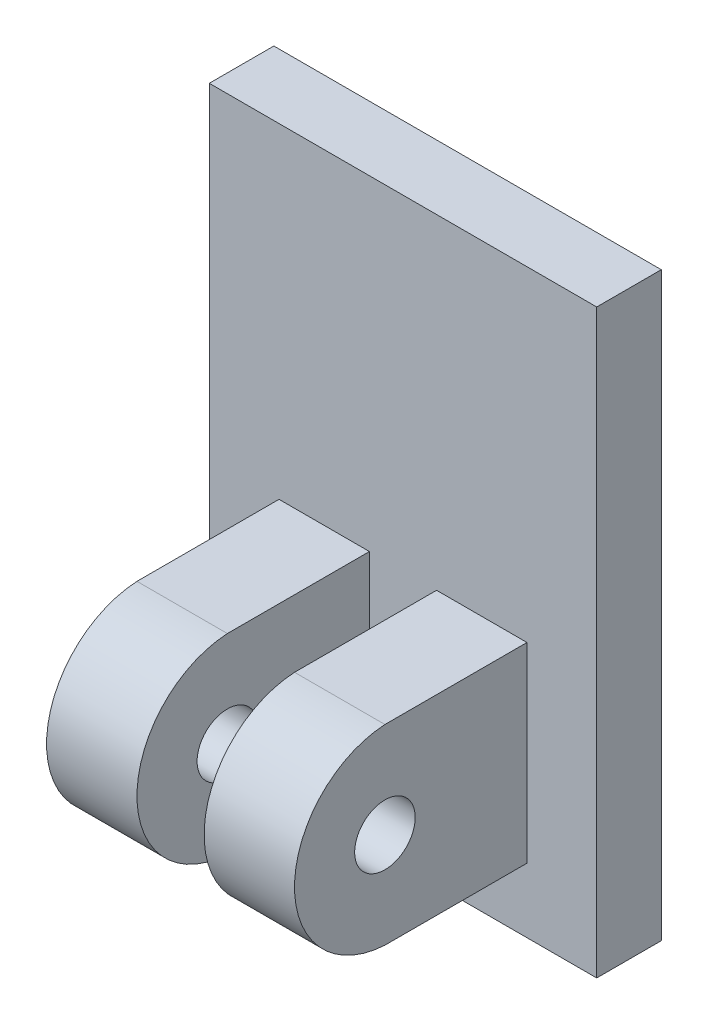
ISO-10303-21;
HEADER;
FILE_DESCRIPTION(('STEP AP214'),'2;1');
FILE_NAME('part.step','',(''),(''),'','','');
FILE_SCHEMA(('AUTOMOTIVE_DESIGN { 1 0 10303 214 1 1 1 1 }'));
ENDSEC;
DATA;
#1=APPLICATION_CONTEXT('core data for automotive mechanical design processes');
#2=APPLICATION_PROTOCOL_DEFINITION('international standard','automotive_design',2000,#1);
#3=PRODUCT_CONTEXT('',#1,'mechanical');
#4=PRODUCT('Part','Part','',(#3));
#5=PRODUCT_RELATED_PRODUCT_CATEGORY('part','',(#4));
#6=PRODUCT_DEFINITION_FORMATION('','',#4);
#7=PRODUCT_DEFINITION_CONTEXT('part definition',#1,'design');
#8=PRODUCT_DEFINITION('design','',#6,#7);
#9=PRODUCT_DEFINITION_SHAPE('','',#8);
#10=(LENGTH_UNIT() NAMED_UNIT(*) SI_UNIT(.MILLI.,.METRE.));
#11=(NAMED_UNIT(*) PLANE_ANGLE_UNIT() SI_UNIT($,.RADIAN.));
#12=(NAMED_UNIT(*) SI_UNIT($,.STERADIAN.) SOLID_ANGLE_UNIT());
#13=UNCERTAINTY_MEASURE_WITH_UNIT(LENGTH_MEASURE(1.E-05),#10,'distance_accuracy_value','');
#14=(GEOMETRIC_REPRESENTATION_CONTEXT(3) GLOBAL_UNCERTAINTY_ASSIGNED_CONTEXT((#13)) GLOBAL_UNIT_ASSIGNED_CONTEXT((#10,
#11,#12)) REPRESENTATION_CONTEXT('',''));
#15=CARTESIAN_POINT('',(0.,0.,0.));
#16=DIRECTION('',(0.,0.,1.));
#17=DIRECTION('',(1.,0.,0.));
#18=AXIS2_PLACEMENT_3D('',#15,#16,#17);
#19=CARTESIAN_POINT('',(12.4,19.8,23.));
#20=DIRECTION('',(1.,0.,0.));
#21=DIRECTION('',(0.,0.,-1.));
#22=AXIS2_PLACEMENT_3D('',#19,#20,#21);
#23=PLANE('',#22);
#24=CARTESIAN_POINT('',(12.4,12.4,16.));
#25=DIRECTION('',(1.,0.,0.));
#26=DIRECTION('',(0.,0.,-1.));
#27=AXIS2_PLACEMENT_3D('',#24,#25,#26);
#28=CIRCLE('',#27,2.34375);
#29=CARTESIAN_POINT('',(12.4,12.4,13.65625));
#30=VERTEX_POINT('',#29);
#31=EDGE_CURVE('E201',#30,#30,#28,.T.);
#32=ORIENTED_EDGE('',*,*,#31,.F.);
#33=EDGE_LOOP('',(#32));
#34=FACE_BOUND('',#33,.T.);
#35=CARTESIAN_POINT('',(12.4,12.4,15.5885714285714));
#36=DIRECTION('',(1.,0.,0.));
#37=DIRECTION('',(0.,0.,-1.));
#38=AXIS2_PLACEMENT_3D('',#35,#36,#37);
#39=CIRCLE('',#38,7.41142857142857);
#40=CARTESIAN_POINT('',(12.4,19.8,16.));
#41=VERTEX_POINT('',#40);
#42=CARTESIAN_POINT('',(12.4,5.,16.));
#43=VERTEX_POINT('',#42);
#44=EDGE_CURVE('E473',#41,#43,#39,.T.);
#45=ORIENTED_EDGE('',*,*,#44,.T.);
#46=DIRECTION('',(0.,0.,-1.));
#47=VECTOR('',#46,1.);
#48=CARTESIAN_POINT('',(12.4,5.,23.));
#49=LINE('',#48,#47);
#50=CARTESIAN_POINT('',(12.4,5.,5.));
#51=VERTEX_POINT('',#50);
#52=EDGE_CURVE('E236',#43,#51,#49,.T.);
#53=ORIENTED_EDGE('',*,*,#52,.T.);
#54=DIRECTION('',(0.,-1.,0.));
#55=VECTOR('',#54,1.);
#56=CARTESIAN_POINT('',(12.4,19.8,5.));
#57=LINE('',#56,#55);
#58=CARTESIAN_POINT('',(12.4,19.8,5.));
#59=VERTEX_POINT('',#58);
#60=EDGE_CURVE('E223',#59,#51,#57,.T.);
#61=ORIENTED_EDGE('',*,*,#60,.F.);
#62=DIRECTION('',(0.,0.,-1.));
#63=VECTOR('',#62,1.);
#64=CARTESIAN_POINT('',(12.4,19.8,23.));
#65=LINE('',#64,#63);
#66=EDGE_CURVE('E234',#41,#59,#65,.T.);
#67=ORIENTED_EDGE('',*,*,#66,.F.);
#68=EDGE_LOOP('',(#45,#53,#61,#67));
#69=FACE_BOUND('',#68,.T.);
#70=ADVANCED_FACE('F83',(#34,#69),#23,.T.);
#71=CARTESIAN_POINT('',(5.4,19.8,23.));
#72=DIRECTION('',(1.,0.,0.));
#73=DIRECTION('',(0.,0.,-1.));
#74=AXIS2_PLACEMENT_3D('',#71,#72,#73);
#75=PLANE('',#74);
#76=CARTESIAN_POINT('',(5.4,12.4,16.));
#77=DIRECTION('',(1.,0.,0.));
#78=DIRECTION('',(0.,0.,-1.));
#79=AXIS2_PLACEMENT_3D('',#76,#77,#78);
#80=CIRCLE('',#79,2.34375);
#81=CARTESIAN_POINT('',(5.4,12.4,13.65625));
#82=VERTEX_POINT('',#81);
#83=EDGE_CURVE('E205',#82,#82,#80,.T.);
#84=ORIENTED_EDGE('',*,*,#83,.T.);
#85=EDGE_LOOP('',(#84));
#86=FACE_BOUND('',#85,.T.);
#87=DIRECTION('',(0.,0.,-1.));
#88=VECTOR('',#87,1.);
#89=CARTESIAN_POINT('',(5.4,5.,23.));
#90=LINE('',#89,#88);
#91=CARTESIAN_POINT('',(5.4,5.,16.));
#92=VERTEX_POINT('',#91);
#93=CARTESIAN_POINT('',(5.4,5.,5.));
#94=VERTEX_POINT('',#93);
#95=EDGE_CURVE('E231',#92,#94,#90,.T.);
#96=ORIENTED_EDGE('',*,*,#95,.F.);
#97=CARTESIAN_POINT('',(5.4,12.4,15.5885714285714));
#98=DIRECTION('',(1.,0.,0.));
#99=DIRECTION('',(0.,0.,-1.));
#100=AXIS2_PLACEMENT_3D('',#97,#98,#99);
#101=CIRCLE('',#100,7.41142857142857);
#102=CARTESIAN_POINT('',(5.4,19.8,16.));
#103=VERTEX_POINT('',#102);
#104=EDGE_CURVE('E186',#103,#92,#101,.T.);
#105=ORIENTED_EDGE('',*,*,#104,.F.);
#106=DIRECTION('',(0.,0.,-1.));
#107=VECTOR('',#106,1.);
#108=CARTESIAN_POINT('',(5.4,19.8,23.));
#109=LINE('',#108,#107);
#110=CARTESIAN_POINT('',(5.4,19.8,5.));
#111=VERTEX_POINT('',#110);
#112=EDGE_CURVE('E107',#103,#111,#109,.T.);
#113=ORIENTED_EDGE('',*,*,#112,.T.);
#114=DIRECTION('',(0.,-1.,0.));
#115=VECTOR('',#114,1.);
#116=CARTESIAN_POINT('',(5.4,19.8,5.));
#117=LINE('',#116,#115);
#118=EDGE_CURVE('E229',#111,#94,#117,.T.);
#119=ORIENTED_EDGE('',*,*,#118,.T.);
#120=EDGE_LOOP('',(#96,#105,#113,#119));
#121=FACE_BOUND('',#120,.T.);
#122=ADVANCED_FACE('F293',(#86,#121),#75,.F.);
#123=CARTESIAN_POINT('',(24.6,19.8,23.));
#124=DIRECTION('',(1.,0.,0.));
#125=DIRECTION('',(0.,1.,0.));
#126=AXIS2_PLACEMENT_3D('',#123,#124,#125);
#127=PLANE('',#126);
#128=CARTESIAN_POINT('',(24.6,12.4,16.));
#129=DIRECTION('',(1.,0.,0.));
#130=DIRECTION('',(0.,1.,0.));
#131=AXIS2_PLACEMENT_3D('',#128,#129,#130);
#132=CIRCLE('',#131,2.34375);
#133=CARTESIAN_POINT('',(24.6,14.74375,16.));
#134=VERTEX_POINT('',#133);
#135=EDGE_CURVE('E475',#134,#134,#132,.T.);
#136=ORIENTED_EDGE('',*,*,#135,.F.);
#137=EDGE_LOOP('',(#136));
#138=FACE_BOUND('',#137,.T.);
#139=CARTESIAN_POINT('',(24.6,12.4,15.5885714285714));
#140=DIRECTION('',(1.,0.,0.));
#141=DIRECTION('',(0.,1.,0.));
#142=AXIS2_PLACEMENT_3D('',#139,#140,#141);
#143=CIRCLE('',#142,7.41142857142857);
#144=CARTESIAN_POINT('',(24.6,19.8,16.));
#145=VERTEX_POINT('',#144);
#146=CARTESIAN_POINT('',(24.6,5.,16.));
#147=VERTEX_POINT('',#146);
#148=EDGE_CURVE('E176',#145,#147,#143,.T.);
#149=ORIENTED_EDGE('',*,*,#148,.T.);
#150=DIRECTION('',(0.,0.,-1.));
#151=VECTOR('',#150,1.);
#152=CARTESIAN_POINT('',(24.6,5.,23.));
#153=LINE('',#152,#151);
#154=CARTESIAN_POINT('',(24.6,5.,5.));
#155=VERTEX_POINT('',#154);
#156=EDGE_CURVE('E181',#147,#155,#153,.T.);
#157=ORIENTED_EDGE('',*,*,#156,.T.);
#158=DIRECTION('',(0.,-1.,0.));
#159=VECTOR('',#158,1.);
#160=CARTESIAN_POINT('',(24.6,19.8,5.));
#161=LINE('',#160,#159);
#162=CARTESIAN_POINT('',(24.6,19.8,5.));
#163=VERTEX_POINT('',#162);
#164=EDGE_CURVE('E217',#163,#155,#161,.T.);
#165=ORIENTED_EDGE('',*,*,#164,.F.);
#166=DIRECTION('',(0.,0.,-1.));
#167=VECTOR('',#166,1.);
#168=CARTESIAN_POINT('',(24.6,19.8,23.));
#169=LINE('',#168,#167);
#170=EDGE_CURVE('E183',#145,#163,#169,.T.);
#171=ORIENTED_EDGE('',*,*,#170,.F.);
#172=EDGE_LOOP('',(#149,#157,#165,#171));
#173=FACE_BOUND('',#172,.T.);
#174=ADVANCED_FACE('F178',(#138,#173),#127,.T.);
#175=CARTESIAN_POINT('',(17.6,19.8,23.));
#176=DIRECTION('',(1.,0.,0.));
#177=DIRECTION('',(0.,1.,0.));
#178=AXIS2_PLACEMENT_3D('',#175,#176,#177);
#179=PLANE('',#178);
#180=CARTESIAN_POINT('',(17.6,12.4,16.));
#181=DIRECTION('',(1.,0.,0.));
#182=DIRECTION('',(0.,1.,0.));
#183=AXIS2_PLACEMENT_3D('',#180,#181,#182);
#184=CIRCLE('',#183,2.34375);
#185=CARTESIAN_POINT('',(17.6,14.74375,16.));
#186=VERTEX_POINT('',#185);
#187=EDGE_CURVE('E87',#186,#186,#184,.T.);
#188=ORIENTED_EDGE('',*,*,#187,.T.);
#189=EDGE_LOOP('',(#188));
#190=FACE_BOUND('',#189,.T.);
#191=DIRECTION('',(0.,0.,-1.));
#192=VECTOR('',#191,1.);
#193=CARTESIAN_POINT('',(17.6,5.,23.));
#194=LINE('',#193,#192);
#195=CARTESIAN_POINT('',(17.6,5.,16.));
#196=VERTEX_POINT('',#195);
#197=CARTESIAN_POINT('',(17.6,5.,5.));
#198=VERTEX_POINT('',#197);
#199=EDGE_CURVE('E210',#196,#198,#194,.T.);
#200=ORIENTED_EDGE('',*,*,#199,.F.);
#201=CARTESIAN_POINT('',(17.6,12.4,15.5885714285714));
#202=DIRECTION('',(1.,0.,0.));
#203=DIRECTION('',(0.,1.,0.));
#204=AXIS2_PLACEMENT_3D('',#201,#202,#203);
#205=CIRCLE('',#204,7.41142857142857);
#206=CARTESIAN_POINT('',(17.6,19.8,16.));
#207=VERTEX_POINT('',#206);
#208=EDGE_CURVE('E187',#207,#196,#205,.T.);
#209=ORIENTED_EDGE('',*,*,#208,.F.);
#210=DIRECTION('',(0.,0.,-1.));
#211=VECTOR('',#210,1.);
#212=CARTESIAN_POINT('',(17.6,19.8,23.));
#213=LINE('',#212,#211);
#214=CARTESIAN_POINT('',(17.6,19.8,5.));
#215=VERTEX_POINT('',#214);
#216=EDGE_CURVE('E99',#207,#215,#213,.T.);
#217=ORIENTED_EDGE('',*,*,#216,.T.);
#218=DIRECTION('',(0.,-1.,0.));
#219=VECTOR('',#218,1.);
#220=CARTESIAN_POINT('',(17.6,19.8,5.));
#221=LINE('',#220,#219);
#222=EDGE_CURVE('E212',#215,#198,#221,.T.);
#223=ORIENTED_EDGE('',*,*,#222,.T.);
#224=EDGE_LOOP('',(#200,#209,#217,#223));
#225=FACE_BOUND('',#224,.T.);
#226=ADVANCED_FACE('F398',(#190,#225),#179,.F.);
#227=CARTESIAN_POINT('',(5.4,19.8,23.));
#228=DIRECTION('',(0.,1.,0.));
#229=DIRECTION('',(-1.,0.,0.));
#230=AXIS2_PLACEMENT_3D('',#227,#228,#229);
#231=PLANE('',#230);
#232=ORIENTED_EDGE('',*,*,#112,.F.);
#233=DIRECTION('',(-1.,0.,0.));
#234=VECTOR('',#233,1.);
#235=CARTESIAN_POINT('',(30.,19.8,16.));
#236=LINE('',#235,#234);
#237=EDGE_CURVE('E194',#41,#103,#236,.T.);
#238=ORIENTED_EDGE('',*,*,#237,.F.);
#239=ORIENTED_EDGE('',*,*,#66,.T.);
#240=DIRECTION('',(1.,0.,0.));
#241=VECTOR('',#240,1.);
#242=CARTESIAN_POINT('',(5.4,19.8,5.));
#243=LINE('',#242,#241);
#244=EDGE_CURVE('E226',#111,#59,#243,.T.);
#245=ORIENTED_EDGE('',*,*,#244,.F.);
#246=EDGE_LOOP('',(#232,#238,#239,#245));
#247=FACE_BOUND('',#246,.T.);
#248=ADVANCED_FACE('F305',(#247),#231,.T.);
#249=CARTESIAN_POINT('',(17.6,19.8,23.));
#250=DIRECTION('',(0.,1.,0.));
#251=DIRECTION('',(0.,0.,1.));
#252=AXIS2_PLACEMENT_3D('',#249,#250,#251);
#253=PLANE('',#252);
#254=ORIENTED_EDGE('',*,*,#216,.F.);
#255=EDGE_CURVE('E466',#145,#207,#236,.T.);
#256=ORIENTED_EDGE('',*,*,#255,.F.);
#257=ORIENTED_EDGE('',*,*,#170,.T.);
#258=DIRECTION('',(1.,0.,0.));
#259=VECTOR('',#258,1.);
#260=CARTESIAN_POINT('',(17.6,19.8,5.));
#261=LINE('',#260,#259);
#262=EDGE_CURVE('E214',#215,#163,#261,.T.);
#263=ORIENTED_EDGE('',*,*,#262,.F.);
#264=EDGE_LOOP('',(#254,#256,#257,#263));
#265=FACE_BOUND('',#264,.T.);
#266=ADVANCED_FACE('F290',(#265),#253,.T.);
#267=CARTESIAN_POINT('',(0.,0.,5.));
#268=DIRECTION('',(0.,0.,1.));
#269=DIRECTION('',(1.,0.,0.));
#270=AXIS2_PLACEMENT_3D('',#267,#268,#269);
#271=PLANE('',#270);
#272=DIRECTION('',(1.,0.,0.));
#273=VECTOR('',#272,1.);
#274=CARTESIAN_POINT('',(0.,0.,5.));
#275=LINE('',#274,#273);
#276=CARTESIAN_POINT('',(0.,0.,5.));
#277=VERTEX_POINT('',#276);
#278=CARTESIAN_POINT('',(30.,0.,5.));
#279=VERTEX_POINT('',#278);
#280=EDGE_CURVE('E239',#277,#279,#275,.T.);
#281=ORIENTED_EDGE('',*,*,#280,.T.);
#282=DIRECTION('',(0.,1.,0.));
#283=VECTOR('',#282,1.);
#284=CARTESIAN_POINT('',(30.,0.,5.));
#285=LINE('',#284,#283);
#286=CARTESIAN_POINT('',(30.,45.,5.));
#287=VERTEX_POINT('',#286);
#288=EDGE_CURVE('E242',#279,#287,#285,.T.);
#289=ORIENTED_EDGE('',*,*,#288,.T.);
#290=DIRECTION('',(1.,0.,0.));
#291=VECTOR('',#290,1.);
#292=CARTESIAN_POINT('',(0.,45.,5.));
#293=LINE('',#292,#291);
#294=CARTESIAN_POINT('',(0.,45.,5.));
#295=VERTEX_POINT('',#294);
#296=EDGE_CURVE('E245',#295,#287,#293,.T.);
#297=ORIENTED_EDGE('',*,*,#296,.F.);
#298=DIRECTION('',(0.,1.,0.));
#299=VECTOR('',#298,1.);
#300=CARTESIAN_POINT('',(0.,0.,5.));
#301=LINE('',#300,#299);
#302=EDGE_CURVE('E248',#277,#295,#301,.T.);
#303=ORIENTED_EDGE('',*,*,#302,.F.);
#304=EDGE_LOOP('',(#281,#289,#297,#303));
#305=FACE_BOUND('',#304,.T.);
#306=ORIENTED_EDGE('',*,*,#60,.T.);
#307=DIRECTION('',(1.,0.,0.));
#308=VECTOR('',#307,1.);
#309=CARTESIAN_POINT('',(5.4,5.,5.));
#310=LINE('',#309,#308);
#311=EDGE_CURVE('E220',#94,#51,#310,.T.);
#312=ORIENTED_EDGE('',*,*,#311,.F.);
#313=ORIENTED_EDGE('',*,*,#118,.F.);
#314=ORIENTED_EDGE('',*,*,#244,.T.);
#315=EDGE_LOOP('',(#306,#312,#313,#314));
#316=FACE_BOUND('',#315,.T.);
#317=ORIENTED_EDGE('',*,*,#164,.T.);
#318=DIRECTION('',(1.,0.,0.));
#319=VECTOR('',#318,1.);
#320=CARTESIAN_POINT('',(17.6,5.,5.));
#321=LINE('',#320,#319);
#322=EDGE_CURVE('E199',#198,#155,#321,.T.);
#323=ORIENTED_EDGE('',*,*,#322,.F.);
#324=ORIENTED_EDGE('',*,*,#222,.F.);
#325=ORIENTED_EDGE('',*,*,#262,.T.);
#326=EDGE_LOOP('',(#317,#323,#324,#325));
#327=FACE_BOUND('',#326,.T.);
#328=ADVANCED_FACE('F282',(#305,#316,#327),#271,.T.);
#329=CARTESIAN_POINT('',(0.,0.,5.));
#330=DIRECTION('',(0.,1.,0.));
#331=DIRECTION('',(0.,0.,1.));
#332=AXIS2_PLACEMENT_3D('',#329,#330,#331);
#333=PLANE('',#332);
#334=DIRECTION('',(1.,0.,0.));
#335=VECTOR('',#334,1.);
#336=CARTESIAN_POINT('',(0.,0.,0.));
#337=LINE('',#336,#335);
#338=CARTESIAN_POINT('',(0.,0.,0.));
#339=VERTEX_POINT('',#338);
#340=CARTESIAN_POINT('',(30.,0.,0.));
#341=VERTEX_POINT('',#340);
#342=EDGE_CURVE('E238',#339,#341,#337,.T.);
#343=ORIENTED_EDGE('',*,*,#342,.T.);
#344=DIRECTION('',(0.,0.,-1.));
#345=VECTOR('',#344,1.);
#346=CARTESIAN_POINT('',(30.,0.,5.));
#347=LINE('',#346,#345);
#348=EDGE_CURVE('E12',#279,#341,#347,.T.);
#349=ORIENTED_EDGE('',*,*,#348,.F.);
#350=ORIENTED_EDGE('',*,*,#280,.F.);
#351=DIRECTION('',(0.,0.,-1.));
#352=VECTOR('',#351,1.);
#353=CARTESIAN_POINT('',(0.,0.,5.));
#354=LINE('',#353,#352);
#355=EDGE_CURVE('E251',#277,#339,#354,.T.);
#356=ORIENTED_EDGE('',*,*,#355,.T.);
#357=EDGE_LOOP('',(#343,#349,#350,#356));
#358=FACE_BOUND('',#357,.T.);
#359=ADVANCED_FACE('F85',(#358),#333,.F.);
#360=CARTESIAN_POINT('',(30.,0.,5.));
#361=DIRECTION('',(-1.,0.,0.));
#362=DIRECTION('',(0.,0.,1.));
#363=AXIS2_PLACEMENT_3D('',#360,#361,#362);
#364=PLANE('',#363);
#365=DIRECTION('',(0.,1.,0.));
#366=VECTOR('',#365,1.);
#367=CARTESIAN_POINT('',(30.,0.,0.));
#368=LINE('',#367,#366);
#369=CARTESIAN_POINT('',(30.,45.,0.));
#370=VERTEX_POINT('',#369);
#371=EDGE_CURVE('E254',#341,#370,#368,.T.);
#372=ORIENTED_EDGE('',*,*,#371,.T.);
#373=DIRECTION('',(0.,0.,-1.));
#374=VECTOR('',#373,1.);
#375=CARTESIAN_POINT('',(30.,45.,5.));
#376=LINE('',#375,#374);
#377=EDGE_CURVE('E92',#287,#370,#376,.T.);
#378=ORIENTED_EDGE('',*,*,#377,.F.);
#379=ORIENTED_EDGE('',*,*,#288,.F.);
#380=ORIENTED_EDGE('',*,*,#348,.T.);
#381=EDGE_LOOP('',(#372,#378,#379,#380));
#382=FACE_BOUND('',#381,.T.);
#383=ADVANCED_FACE('F271',(#382),#364,.F.);
#384=CARTESIAN_POINT('',(0.,45.,5.));
#385=DIRECTION('',(0.,1.,0.));
#386=DIRECTION('',(0.,0.,1.));
#387=AXIS2_PLACEMENT_3D('',#384,#385,#386);
#388=PLANE('',#387);
#389=DIRECTION('',(1.,0.,0.));
#390=VECTOR('',#389,1.);
#391=CARTESIAN_POINT('',(0.,45.,0.));
#392=LINE('',#391,#390);
#393=CARTESIAN_POINT('',(0.,45.,0.));
#394=VERTEX_POINT('',#393);
#395=EDGE_CURVE('E257',#394,#370,#392,.T.);
#396=ORIENTED_EDGE('',*,*,#395,.F.);
#397=DIRECTION('',(0.,0.,-1.));
#398=VECTOR('',#397,1.);
#399=CARTESIAN_POINT('',(0.,45.,5.));
#400=LINE('',#399,#398);
#401=EDGE_CURVE('E263',#295,#394,#400,.T.);
#402=ORIENTED_EDGE('',*,*,#401,.F.);
#403=ORIENTED_EDGE('',*,*,#296,.T.);
#404=ORIENTED_EDGE('',*,*,#377,.T.);
#405=EDGE_LOOP('',(#396,#402,#403,#404));
#406=FACE_BOUND('',#405,.T.);
#407=ADVANCED_FACE('F268',(#406),#388,.T.);
#408=CARTESIAN_POINT('',(0.,0.,5.));
#409=DIRECTION('',(-1.,0.,0.));
#410=DIRECTION('',(0.,0.,1.));
#411=AXIS2_PLACEMENT_3D('',#408,#409,#410);
#412=PLANE('',#411);
#413=DIRECTION('',(0.,1.,0.));
#414=VECTOR('',#413,1.);
#415=CARTESIAN_POINT('',(0.,0.,0.));
#416=LINE('',#415,#414);
#417=EDGE_CURVE('E243',#339,#394,#416,.T.);
#418=ORIENTED_EDGE('',*,*,#417,.F.);
#419=ORIENTED_EDGE('',*,*,#355,.F.);
#420=ORIENTED_EDGE('',*,*,#302,.T.);
#421=ORIENTED_EDGE('',*,*,#401,.T.);
#422=EDGE_LOOP('',(#418,#419,#420,#421));
#423=FACE_BOUND('',#422,.T.);
#424=ADVANCED_FACE('F278',(#423),#412,.T.);
#425=CARTESIAN_POINT('',(0.,0.,0.));
#426=DIRECTION('',(0.,0.,1.));
#427=DIRECTION('',(1.,0.,0.));
#428=AXIS2_PLACEMENT_3D('',#425,#426,#427);
#429=PLANE('',#428);
#430=ORIENTED_EDGE('',*,*,#342,.F.);
#431=ORIENTED_EDGE('',*,*,#417,.T.);
#432=ORIENTED_EDGE('',*,*,#395,.T.);
#433=ORIENTED_EDGE('',*,*,#371,.F.);
#434=EDGE_LOOP('',(#430,#431,#432,#433));
#435=FACE_BOUND('',#434,.T.);
#436=ADVANCED_FACE('F275',(#435),#429,.F.);
#437=CARTESIAN_POINT('',(5.4,5.,23.));
#438=DIRECTION('',(0.,1.,0.));
#439=DIRECTION('',(-1.,0.,0.));
#440=AXIS2_PLACEMENT_3D('',#437,#438,#439);
#441=PLANE('',#440);
#442=ORIENTED_EDGE('',*,*,#52,.F.);
#443=DIRECTION('',(-1.,0.,0.));
#444=VECTOR('',#443,1.);
#445=CARTESIAN_POINT('',(30.,5.,16.));
#446=LINE('',#445,#444);
#447=EDGE_CURVE('E195',#43,#92,#446,.T.);
#448=ORIENTED_EDGE('',*,*,#447,.T.);
#449=ORIENTED_EDGE('',*,*,#95,.T.);
#450=ORIENTED_EDGE('',*,*,#311,.T.);
#451=EDGE_LOOP('',(#442,#448,#449,#450));
#452=FACE_BOUND('',#451,.T.);
#453=ADVANCED_FACE('F306',(#452),#441,.F.);
#454=CARTESIAN_POINT('',(17.6,5.,23.));
#455=DIRECTION('',(0.,1.,0.));
#456=DIRECTION('',(-1.,0.,0.));
#457=AXIS2_PLACEMENT_3D('',#454,#455,#456);
#458=PLANE('',#457);
#459=ORIENTED_EDGE('',*,*,#156,.F.);
#460=EDGE_CURVE('E190',#147,#196,#446,.T.);
#461=ORIENTED_EDGE('',*,*,#460,.T.);
#462=ORIENTED_EDGE('',*,*,#199,.T.);
#463=ORIENTED_EDGE('',*,*,#322,.T.);
#464=EDGE_LOOP('',(#459,#461,#462,#463));
#465=FACE_BOUND('',#464,.T.);
#466=ADVANCED_FACE('F197',(#465),#458,.F.);
#467=CARTESIAN_POINT('',(30.,12.4,15.5885714285714));
#468=DIRECTION('',(-1.,0.,0.));
#469=DIRECTION('',(0.,0.,1.));
#470=AXIS2_PLACEMENT_3D('',#467,#468,#469);
#471=CYLINDRICAL_SURFACE('',#470,7.41142857142857);
#472=ORIENTED_EDGE('',*,*,#255,.T.);
#473=ORIENTED_EDGE('',*,*,#208,.T.);
#474=ORIENTED_EDGE('',*,*,#460,.F.);
#475=ORIENTED_EDGE('',*,*,#148,.F.);
#476=EDGE_LOOP('',(#472,#473,#474,#475));
#477=FACE_BOUND('',#476,.T.);
#478=ADVANCED_FACE('F191',(#477),#471,.T.);
#479=CARTESIAN_POINT('',(30.,12.4,16.));
#480=DIRECTION('',(-1.,0.,0.));
#481=DIRECTION('',(0.,0.,1.));
#482=AXIS2_PLACEMENT_3D('',#479,#480,#481);
#483=CYLINDRICAL_SURFACE('',#482,2.34375);
#484=ORIENTED_EDGE('',*,*,#135,.T.);
#485=EDGE_LOOP('',(#484));
#486=FACE_BOUND('',#485,.T.);
#487=ORIENTED_EDGE('',*,*,#187,.F.);
#488=EDGE_LOOP('',(#487));
#489=FACE_BOUND('',#488,.T.);
#490=ADVANCED_FACE('F345',(#486,#489),#483,.F.);
#491=ORIENTED_EDGE('',*,*,#237,.T.);
#492=ORIENTED_EDGE('',*,*,#104,.T.);
#493=ORIENTED_EDGE('',*,*,#447,.F.);
#494=ORIENTED_EDGE('',*,*,#44,.F.);
#495=EDGE_LOOP('',(#491,#492,#493,#494));
#496=FACE_BOUND('',#495,.T.);
#497=ADVANCED_FACE('F347',(#496),#471,.T.);
#498=ORIENTED_EDGE('',*,*,#31,.T.);
#499=EDGE_LOOP('',(#498));
#500=FACE_BOUND('',#499,.T.);
#501=ORIENTED_EDGE('',*,*,#83,.F.);
#502=EDGE_LOOP('',(#501));
#503=FACE_BOUND('',#502,.T.);
#504=ADVANCED_FACE('F355',(#500,#503),#483,.F.);
#505=CLOSED_SHELL('',(#70,#122,#174,#226,#248,#266,#328,#359,#383,#407,#424,#436,#453,#466,#478,
#490,#497,#504));
#506=MANIFOLD_SOLID_BREP('B2',#505);
#507=ADVANCED_BREP_SHAPE_REPRESENTATION('',(#18,#506),#14);
#508=SHAPE_DEFINITION_REPRESENTATION(#9,#507);
ENDSEC;
END-ISO-10303-21;
